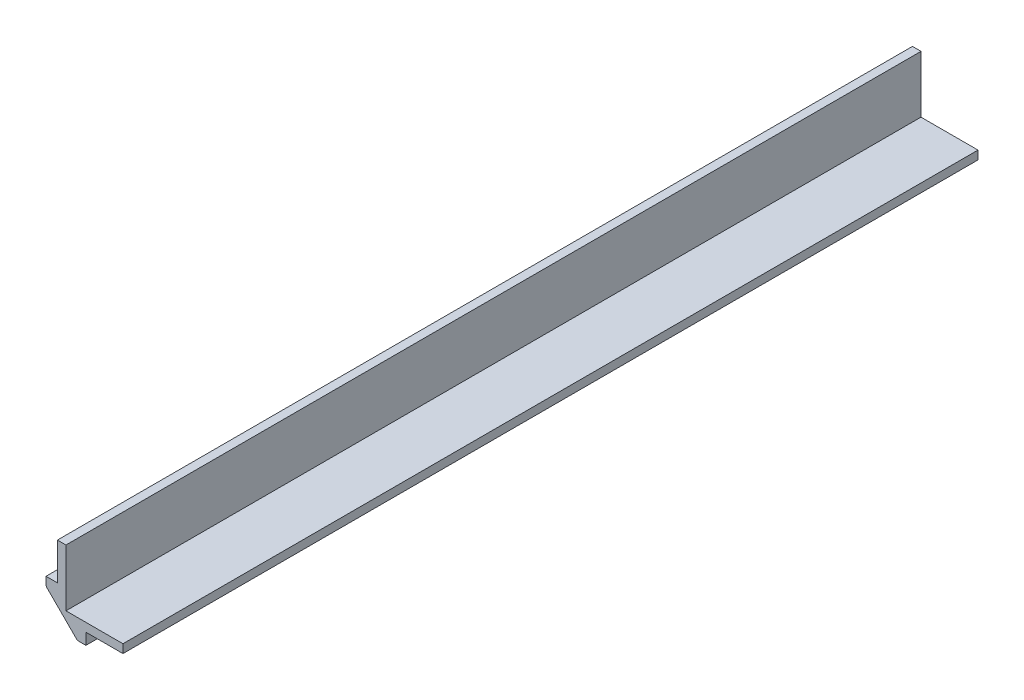
ISO-10303-21;
HEADER;
FILE_DESCRIPTION(('STEP AP214'),'2;1');
FILE_NAME('part.step','',(''),(''),'','','');
FILE_SCHEMA(('AUTOMOTIVE_DESIGN { 1 0 10303 214 1 1 1 1 }'));
ENDSEC;
DATA;
#1=APPLICATION_CONTEXT('core data for automotive mechanical design processes');
#2=APPLICATION_PROTOCOL_DEFINITION('international standard','automotive_design',2000,#1);
#3=PRODUCT_CONTEXT('',#1,'mechanical');
#4=PRODUCT('Part','Part','',(#3));
#5=PRODUCT_RELATED_PRODUCT_CATEGORY('part','',(#4));
#6=PRODUCT_DEFINITION_FORMATION('','',#4);
#7=PRODUCT_DEFINITION_CONTEXT('part definition',#1,'design');
#8=PRODUCT_DEFINITION('design','',#6,#7);
#9=PRODUCT_DEFINITION_SHAPE('','',#8);
#10=(LENGTH_UNIT() NAMED_UNIT(*) SI_UNIT(.MILLI.,.METRE.));
#11=(NAMED_UNIT(*) PLANE_ANGLE_UNIT() SI_UNIT($,.RADIAN.));
#12=(NAMED_UNIT(*) SI_UNIT($,.STERADIAN.) SOLID_ANGLE_UNIT());
#13=UNCERTAINTY_MEASURE_WITH_UNIT(LENGTH_MEASURE(1.E-05),#10,'distance_accuracy_value','');
#14=(GEOMETRIC_REPRESENTATION_CONTEXT(3) GLOBAL_UNCERTAINTY_ASSIGNED_CONTEXT((#13)) GLOBAL_UNIT_ASSIGNED_CONTEXT((#10,
#11,#12)) REPRESENTATION_CONTEXT('',''));
#15=CARTESIAN_POINT('',(0.,0.,0.));
#16=DIRECTION('',(0.,0.,1.));
#17=DIRECTION('',(1.,0.,0.));
#18=AXIS2_PLACEMENT_3D('',#15,#16,#17);
#19=CARTESIAN_POINT('',(-7.,7.,-20.));
#20=DIRECTION('',(-1.,0.,0.));
#21=DIRECTION('',(0.,0.,1.));
#22=AXIS2_PLACEMENT_3D('',#19,#20,#21);
#23=PLANE('',#22);
#24=DIRECTION('',(0.,-1.,0.));
#25=VECTOR('',#24,1.);
#26=CARTESIAN_POINT('',(-7.,7.,-20.));
#27=LINE('',#26,#25);
#28=CARTESIAN_POINT('',(-7.,7.,-20.));
#29=VERTEX_POINT('',#28);
#30=CARTESIAN_POINT('',(-7.,4.62132034355964,-20.));
#31=VERTEX_POINT('',#30);
#32=EDGE_CURVE('E235',#29,#31,#27,.T.);
#33=ORIENTED_EDGE('',*,*,#32,.T.);
#34=DIRECTION('',(0.,0.,1.));
#35=VECTOR('',#34,1.);
#36=CARTESIAN_POINT('',(-7.,4.62132034355964,-20.));
#37=LINE('',#36,#35);
#38=CARTESIAN_POINT('',(-7.,4.62132034355964,280.));
#39=VERTEX_POINT('',#38);
#40=EDGE_CURVE('E239',#31,#39,#37,.T.);
#41=ORIENTED_EDGE('',*,*,#40,.T.);
#42=DIRECTION('',(0.,-1.,0.));
#43=VECTOR('',#42,1.);
#44=CARTESIAN_POINT('',(-7.,7.,280.));
#45=LINE('',#44,#43);
#46=CARTESIAN_POINT('',(-7.,7.,280.));
#47=VERTEX_POINT('',#46);
#48=EDGE_CURVE('E194',#47,#39,#45,.T.);
#49=ORIENTED_EDGE('',*,*,#48,.F.);
#50=DIRECTION('',(0.,0.,1.));
#51=VECTOR('',#50,1.);
#52=CARTESIAN_POINT('',(-7.,7.,-20.));
#53=LINE('',#52,#51);
#54=EDGE_CURVE('E236',#29,#47,#53,.T.);
#55=ORIENTED_EDGE('',*,*,#54,.F.);
#56=EDGE_LOOP('',(#33,#41,#49,#55));
#57=FACE_BOUND('',#56,.T.);
#58=ADVANCED_FACE('F47',(#57),#23,.T.);
#59=CARTESIAN_POINT('',(-3.,7.,-20.));
#60=DIRECTION('',(0.,1.,0.));
#61=DIRECTION('',(0.,0.,1.));
#62=AXIS2_PLACEMENT_3D('',#59,#60,#61);
#63=PLANE('',#62);
#64=DIRECTION('',(-1.,0.,0.));
#65=VECTOR('',#64,1.);
#66=CARTESIAN_POINT('',(-3.,7.,280.));
#67=LINE('',#66,#65);
#68=CARTESIAN_POINT('',(-3.,7.,280.));
#69=VERTEX_POINT('',#68);
#70=EDGE_CURVE('E231',#69,#47,#67,.T.);
#71=ORIENTED_EDGE('',*,*,#70,.F.);
#72=DIRECTION('',(0.,0.,1.));
#73=VECTOR('',#72,1.);
#74=CARTESIAN_POINT('',(-3.,7.,-20.));
#75=LINE('',#74,#73);
#76=CARTESIAN_POINT('',(-3.,7.,-20.));
#77=VERTEX_POINT('',#76);
#78=EDGE_CURVE('E240',#77,#69,#75,.T.);
#79=ORIENTED_EDGE('',*,*,#78,.F.);
#80=DIRECTION('',(-1.,0.,0.));
#81=VECTOR('',#80,1.);
#82=CARTESIAN_POINT('',(-3.,7.,-20.));
#83=LINE('',#82,#81);
#84=EDGE_CURVE('E158',#77,#29,#83,.T.);
#85=ORIENTED_EDGE('',*,*,#84,.T.);
#86=ORIENTED_EDGE('',*,*,#54,.T.);
#87=EDGE_LOOP('',(#71,#79,#85,#86));
#88=FACE_BOUND('',#87,.T.);
#89=ADVANCED_FACE('F321',(#88),#63,.T.);
#90=CARTESIAN_POINT('',(-3.,20.,-20.));
#91=DIRECTION('',(-1.,0.,0.));
#92=DIRECTION('',(0.,0.,1.));
#93=AXIS2_PLACEMENT_3D('',#90,#91,#92);
#94=PLANE('',#93);
#95=DIRECTION('',(0.,-1.,0.));
#96=VECTOR('',#95,1.);
#97=CARTESIAN_POINT('',(-3.,20.,280.));
#98=LINE('',#97,#96);
#99=CARTESIAN_POINT('',(-3.,20.,280.));
#100=VERTEX_POINT('',#99);
#101=EDGE_CURVE('E227',#100,#69,#98,.T.);
#102=ORIENTED_EDGE('',*,*,#101,.F.);
#103=DIRECTION('',(0.,0.,1.));
#104=VECTOR('',#103,1.);
#105=CARTESIAN_POINT('',(-3.,20.,-20.));
#106=LINE('',#105,#104);
#107=CARTESIAN_POINT('',(-3.,20.,-20.));
#108=VERTEX_POINT('',#107);
#109=EDGE_CURVE('E243',#108,#100,#106,.T.);
#110=ORIENTED_EDGE('',*,*,#109,.F.);
#111=DIRECTION('',(0.,-1.,0.));
#112=VECTOR('',#111,1.);
#113=CARTESIAN_POINT('',(-3.,20.,-20.));
#114=LINE('',#113,#112);
#115=EDGE_CURVE('E187',#108,#77,#114,.T.);
#116=ORIENTED_EDGE('',*,*,#115,.T.);
#117=ORIENTED_EDGE('',*,*,#78,.T.);
#118=EDGE_LOOP('',(#102,#110,#116,#117));
#119=FACE_BOUND('',#118,.T.);
#120=ADVANCED_FACE('F318',(#119),#94,.T.);
#121=CARTESIAN_POINT('',(0.,20.,-20.));
#122=DIRECTION('',(0.,1.,0.));
#123=DIRECTION('',(0.,0.,1.));
#124=AXIS2_PLACEMENT_3D('',#121,#122,#123);
#125=PLANE('',#124);
#126=DIRECTION('',(-1.,0.,0.));
#127=VECTOR('',#126,1.);
#128=CARTESIAN_POINT('',(0.,20.,280.));
#129=LINE('',#128,#127);
#130=CARTESIAN_POINT('',(0.,20.,280.));
#131=VERTEX_POINT('',#130);
#132=EDGE_CURVE('E223',#131,#100,#129,.T.);
#133=ORIENTED_EDGE('',*,*,#132,.F.);
#134=DIRECTION('',(0.,0.,1.));
#135=VECTOR('',#134,1.);
#136=CARTESIAN_POINT('',(0.,20.,-20.));
#137=LINE('',#136,#135);
#138=CARTESIAN_POINT('',(0.,20.,-20.));
#139=VERTEX_POINT('',#138);
#140=EDGE_CURVE('E246',#139,#131,#137,.T.);
#141=ORIENTED_EDGE('',*,*,#140,.F.);
#142=DIRECTION('',(-1.,0.,0.));
#143=VECTOR('',#142,1.);
#144=CARTESIAN_POINT('',(0.,20.,-20.));
#145=LINE('',#144,#143);
#146=EDGE_CURVE('E183',#139,#108,#145,.T.);
#147=ORIENTED_EDGE('',*,*,#146,.T.);
#148=ORIENTED_EDGE('',*,*,#109,.T.);
#149=EDGE_LOOP('',(#133,#141,#147,#148));
#150=FACE_BOUND('',#149,.T.);
#151=ADVANCED_FACE('F314',(#150),#125,.T.);
#152=CARTESIAN_POINT('',(0.,0.,-20.));
#153=DIRECTION('',(1.,0.,0.));
#154=DIRECTION('',(0.,1.,0.));
#155=AXIS2_PLACEMENT_3D('',#152,#153,#154);
#156=PLANE('',#155);
#157=DIRECTION('',(0.,1.,0.));
#158=VECTOR('',#157,1.);
#159=CARTESIAN_POINT('',(0.,0.,280.));
#160=LINE('',#159,#158);
#161=CARTESIAN_POINT('',(0.,0.,280.));
#162=VERTEX_POINT('',#161);
#163=EDGE_CURVE('E219',#162,#131,#160,.T.);
#164=ORIENTED_EDGE('',*,*,#163,.F.);
#165=DIRECTION('',(0.,0.,1.));
#166=VECTOR('',#165,1.);
#167=CARTESIAN_POINT('',(0.,0.,-20.));
#168=LINE('',#167,#166);
#169=CARTESIAN_POINT('',(0.,0.,-20.));
#170=VERTEX_POINT('',#169);
#171=EDGE_CURVE('E249',#170,#162,#168,.T.);
#172=ORIENTED_EDGE('',*,*,#171,.F.);
#173=DIRECTION('',(0.,1.,0.));
#174=VECTOR('',#173,1.);
#175=CARTESIAN_POINT('',(0.,0.,-20.));
#176=LINE('',#175,#174);
#177=EDGE_CURVE('E179',#170,#139,#176,.T.);
#178=ORIENTED_EDGE('',*,*,#177,.T.);
#179=ORIENTED_EDGE('',*,*,#140,.T.);
#180=EDGE_LOOP('',(#164,#172,#178,#179));
#181=FACE_BOUND('',#180,.T.);
#182=ADVANCED_FACE('F310',(#181),#156,.T.);
#183=CARTESIAN_POINT('',(20.,0.,-20.));
#184=DIRECTION('',(0.,1.,0.));
#185=DIRECTION('',(0.,0.,1.));
#186=AXIS2_PLACEMENT_3D('',#183,#184,#185);
#187=PLANE('',#186);
#188=DIRECTION('',(-1.,0.,0.));
#189=VECTOR('',#188,1.);
#190=CARTESIAN_POINT('',(20.,0.,280.));
#191=LINE('',#190,#189);
#192=CARTESIAN_POINT('',(20.,0.,280.));
#193=VERTEX_POINT('',#192);
#194=EDGE_CURVE('E215',#193,#162,#191,.T.);
#195=ORIENTED_EDGE('',*,*,#194,.F.);
#196=DIRECTION('',(0.,0.,1.));
#197=VECTOR('',#196,1.);
#198=CARTESIAN_POINT('',(20.,0.,-20.));
#199=LINE('',#198,#197);
#200=CARTESIAN_POINT('',(20.,0.,-20.));
#201=VERTEX_POINT('',#200);
#202=EDGE_CURVE('E252',#201,#193,#199,.T.);
#203=ORIENTED_EDGE('',*,*,#202,.F.);
#204=DIRECTION('',(-1.,0.,0.));
#205=VECTOR('',#204,1.);
#206=CARTESIAN_POINT('',(20.,0.,-20.));
#207=LINE('',#206,#205);
#208=EDGE_CURVE('E175',#201,#170,#207,.T.);
#209=ORIENTED_EDGE('',*,*,#208,.T.);
#210=ORIENTED_EDGE('',*,*,#171,.T.);
#211=EDGE_LOOP('',(#195,#203,#209,#210));
#212=FACE_BOUND('',#211,.T.);
#213=ADVANCED_FACE('F306',(#212),#187,.T.);
#214=CARTESIAN_POINT('',(20.,-3.,-20.));
#215=DIRECTION('',(1.,0.,0.));
#216=DIRECTION('',(0.,0.,-1.));
#217=AXIS2_PLACEMENT_3D('',#214,#215,#216);
#218=PLANE('',#217);
#219=DIRECTION('',(0.,1.,0.));
#220=VECTOR('',#219,1.);
#221=CARTESIAN_POINT('',(20.,-3.,280.));
#222=LINE('',#221,#220);
#223=CARTESIAN_POINT('',(20.,-3.,280.));
#224=VERTEX_POINT('',#223);
#225=EDGE_CURVE('E211',#224,#193,#222,.T.);
#226=ORIENTED_EDGE('',*,*,#225,.F.);
#227=DIRECTION('',(0.,0.,1.));
#228=VECTOR('',#227,1.);
#229=CARTESIAN_POINT('',(20.,-3.,-20.));
#230=LINE('',#229,#228);
#231=CARTESIAN_POINT('',(20.,-3.,-20.));
#232=VERTEX_POINT('',#231);
#233=EDGE_CURVE('E255',#232,#224,#230,.T.);
#234=ORIENTED_EDGE('',*,*,#233,.F.);
#235=DIRECTION('',(0.,1.,0.));
#236=VECTOR('',#235,1.);
#237=CARTESIAN_POINT('',(20.,-3.,-20.));
#238=LINE('',#237,#236);
#239=EDGE_CURVE('E168',#232,#201,#238,.T.);
#240=ORIENTED_EDGE('',*,*,#239,.T.);
#241=ORIENTED_EDGE('',*,*,#202,.T.);
#242=EDGE_LOOP('',(#226,#234,#240,#241));
#243=FACE_BOUND('',#242,.T.);
#244=ADVANCED_FACE('F302',(#243),#218,.T.);
#245=CARTESIAN_POINT('',(7.,-3.,-20.));
#246=DIRECTION('',(0.,-1.,0.));
#247=DIRECTION('',(0.,0.,-1.));
#248=AXIS2_PLACEMENT_3D('',#245,#246,#247);
#249=PLANE('',#248);
#250=DIRECTION('',(1.,0.,0.));
#251=VECTOR('',#250,1.);
#252=CARTESIAN_POINT('',(7.,-3.,280.));
#253=LINE('',#252,#251);
#254=CARTESIAN_POINT('',(7.,-3.,280.));
#255=VERTEX_POINT('',#254);
#256=EDGE_CURVE('E207',#255,#224,#253,.T.);
#257=ORIENTED_EDGE('',*,*,#256,.F.);
#258=DIRECTION('',(0.,0.,1.));
#259=VECTOR('',#258,1.);
#260=CARTESIAN_POINT('',(7.,-3.,-20.));
#261=LINE('',#260,#259);
#262=CARTESIAN_POINT('',(7.,-3.,-20.));
#263=VERTEX_POINT('',#262);
#264=EDGE_CURVE('E157',#263,#255,#261,.T.);
#265=ORIENTED_EDGE('',*,*,#264,.F.);
#266=DIRECTION('',(1.,0.,0.));
#267=VECTOR('',#266,1.);
#268=CARTESIAN_POINT('',(7.,-3.,-20.));
#269=LINE('',#268,#267);
#270=EDGE_CURVE('E164',#263,#232,#269,.T.);
#271=ORIENTED_EDGE('',*,*,#270,.T.);
#272=ORIENTED_EDGE('',*,*,#233,.T.);
#273=EDGE_LOOP('',(#257,#265,#271,#272));
#274=FACE_BOUND('',#273,.T.);
#275=ADVANCED_FACE('F300',(#274),#249,.T.);
#276=CARTESIAN_POINT('',(7.,-7.,-20.));
#277=DIRECTION('',(1.,0.,0.));
#278=DIRECTION('',(0.,0.,-1.));
#279=AXIS2_PLACEMENT_3D('',#276,#277,#278);
#280=PLANE('',#279);
#281=DIRECTION('',(0.,1.,0.));
#282=VECTOR('',#281,1.);
#283=CARTESIAN_POINT('',(7.,-7.,280.));
#284=LINE('',#283,#282);
#285=CARTESIAN_POINT('',(7.,-7.,280.));
#286=VERTEX_POINT('',#285);
#287=EDGE_CURVE('E155',#286,#255,#284,.T.);
#288=ORIENTED_EDGE('',*,*,#287,.F.);
#289=DIRECTION('',(0.,0.,1.));
#290=VECTOR('',#289,1.);
#291=CARTESIAN_POINT('',(7.,-7.,-20.));
#292=LINE('',#291,#290);
#293=CARTESIAN_POINT('',(7.,-7.,-20.));
#294=VERTEX_POINT('',#293);
#295=EDGE_CURVE('E144',#294,#286,#292,.T.);
#296=ORIENTED_EDGE('',*,*,#295,.F.);
#297=DIRECTION('',(0.,1.,0.));
#298=VECTOR('',#297,1.);
#299=CARTESIAN_POINT('',(7.,-7.,-20.));
#300=LINE('',#299,#298);
#301=EDGE_CURVE('E148',#294,#263,#300,.T.);
#302=ORIENTED_EDGE('',*,*,#301,.T.);
#303=ORIENTED_EDGE('',*,*,#264,.T.);
#304=EDGE_LOOP('',(#288,#296,#302,#303));
#305=FACE_BOUND('',#304,.T.);
#306=ADVANCED_FACE('F153',(#305),#280,.T.);
#307=CARTESIAN_POINT('',(4.,-7.,-20.));
#308=DIRECTION('',(0.,-1.,0.));
#309=DIRECTION('',(0.,0.,-1.));
#310=AXIS2_PLACEMENT_3D('',#307,#308,#309);
#311=PLANE('',#310);
#312=DIRECTION('',(1.,0.,0.));
#313=VECTOR('',#312,1.);
#314=CARTESIAN_POINT('',(4.,-7.,280.));
#315=LINE('',#314,#313);
#316=CARTESIAN_POINT('',(4.62132034355964,-7.,280.));
#317=VERTEX_POINT('',#316);
#318=EDGE_CURVE('E202',#317,#286,#315,.T.);
#319=ORIENTED_EDGE('',*,*,#318,.F.);
#320=DIRECTION('',(0.,0.,1.));
#321=VECTOR('',#320,1.);
#322=CARTESIAN_POINT('',(4.62132034355964,-7.,-20.));
#323=LINE('',#322,#321);
#324=CARTESIAN_POINT('',(4.62132034355964,-7.,-20.));
#325=VERTEX_POINT('',#324);
#326=EDGE_CURVE('E11',#317,#325,#323,.F.);
#327=ORIENTED_EDGE('',*,*,#326,.T.);
#328=DIRECTION('',(1.,0.,0.));
#329=VECTOR('',#328,1.);
#330=CARTESIAN_POINT('',(4.,-7.,-20.));
#331=LINE('',#330,#329);
#332=EDGE_CURVE('E141',#325,#294,#331,.T.);
#333=ORIENTED_EDGE('',*,*,#332,.T.);
#334=ORIENTED_EDGE('',*,*,#295,.T.);
#335=EDGE_LOOP('',(#319,#327,#333,#334));
#336=FACE_BOUND('',#335,.T.);
#337=ADVANCED_FACE('F143',(#336),#311,.T.);
#338=CARTESIAN_POINT('',(-7.,4.,-20.));
#339=DIRECTION('',(-0.707106781186548,-0.707106781186548,0.));
#340=DIRECTION('',(0.707106781186548,-0.707106781186548,0.));
#341=AXIS2_PLACEMENT_3D('',#338,#339,#340);
#342=PLANE('',#341);
#343=DIRECTION('',(0.707106781186548,-0.707106781186548,0.));
#344=VECTOR('',#343,1.);
#345=CARTESIAN_POINT('',(-7.,4.,280.));
#346=LINE('',#345,#344);
#347=CARTESIAN_POINT('',(-6.56066017177982,3.56066017177982,280.));
#348=VERTEX_POINT('',#347);
#349=CARTESIAN_POINT('',(3.56066017177982,-6.56066017177982,280.));
#350=VERTEX_POINT('',#349);
#351=EDGE_CURVE('E198',#348,#350,#346,.T.);
#352=ORIENTED_EDGE('',*,*,#351,.F.);
#353=DIRECTION('',(0.,0.,1.));
#354=VECTOR('',#353,1.);
#355=CARTESIAN_POINT('',(-6.56066017177982,3.56066017177982,-20.));
#356=LINE('',#355,#354);
#357=CARTESIAN_POINT('',(-6.56066017177982,3.56066017177982,-20.));
#358=VERTEX_POINT('',#357);
#359=EDGE_CURVE('E273',#348,#358,#356,.F.);
#360=ORIENTED_EDGE('',*,*,#359,.T.);
#361=DIRECTION('',(0.707106781186548,-0.707106781186548,0.));
#362=VECTOR('',#361,1.);
#363=CARTESIAN_POINT('',(-7.,4.,-20.));
#364=LINE('',#363,#362);
#365=CARTESIAN_POINT('',(3.56066017177982,-6.56066017177982,-20.));
#366=VERTEX_POINT('',#365);
#367=EDGE_CURVE('E149',#358,#366,#364,.T.);
#368=ORIENTED_EDGE('',*,*,#367,.T.);
#369=DIRECTION('',(0.,0.,1.));
#370=VECTOR('',#369,1.);
#371=CARTESIAN_POINT('',(3.56066017177982,-6.56066017177982,-20.));
#372=LINE('',#371,#370);
#373=EDGE_CURVE('E269',#366,#350,#372,.T.);
#374=ORIENTED_EDGE('',*,*,#373,.T.);
#375=EDGE_LOOP('',(#352,#360,#368,#374));
#376=FACE_BOUND('',#375,.T.);
#377=ADVANCED_FACE('F294',(#376),#342,.T.);
#378=CARTESIAN_POINT('',(0.,0.,-20.));
#379=DIRECTION('',(0.,0.,1.));
#380=DIRECTION('',(1.,0.,0.));
#381=AXIS2_PLACEMENT_3D('',#378,#379,#380);
#382=PLANE('',#381);
#383=ORIENTED_EDGE('',*,*,#367,.F.);
#384=CARTESIAN_POINT('',(-5.5,4.62132034355964,-20.));
#385=DIRECTION('',(0.,0.,1.));
#386=DIRECTION('',(1.,0.,0.));
#387=AXIS2_PLACEMENT_3D('',#384,#385,#386);
#388=CIRCLE('',#387,1.5);
#389=EDGE_CURVE('E56',#358,#31,#388,.F.);
#390=ORIENTED_EDGE('',*,*,#389,.T.);
#391=ORIENTED_EDGE('',*,*,#32,.F.);
#392=ORIENTED_EDGE('',*,*,#84,.F.);
#393=ORIENTED_EDGE('',*,*,#115,.F.);
#394=ORIENTED_EDGE('',*,*,#146,.F.);
#395=ORIENTED_EDGE('',*,*,#177,.F.);
#396=ORIENTED_EDGE('',*,*,#208,.F.);
#397=ORIENTED_EDGE('',*,*,#239,.F.);
#398=ORIENTED_EDGE('',*,*,#270,.F.);
#399=ORIENTED_EDGE('',*,*,#301,.F.);
#400=ORIENTED_EDGE('',*,*,#332,.F.);
#401=CARTESIAN_POINT('',(4.62132034355964,-5.5,-20.));
#402=DIRECTION('',(0.,0.,1.));
#403=DIRECTION('',(1.,0.,0.));
#404=AXIS2_PLACEMENT_3D('',#401,#402,#403);
#405=CIRCLE('',#404,1.5);
#406=EDGE_CURVE('E68',#325,#366,#405,.F.);
#407=ORIENTED_EDGE('',*,*,#406,.T.);
#408=EDGE_LOOP('',(#383,#390,#391,#392,#393,#394,#395,#396,#397,#398,#399,#400,#407));
#409=FACE_BOUND('',#408,.T.);
#410=ADVANCED_FACE('F161',(#409),#382,.F.);
#411=CARTESIAN_POINT('',(0.,0.,280.));
#412=DIRECTION('',(0.,0.,1.));
#413=DIRECTION('',(1.,0.,0.));
#414=AXIS2_PLACEMENT_3D('',#411,#412,#413);
#415=PLANE('',#414);
#416=ORIENTED_EDGE('',*,*,#48,.T.);
#417=CARTESIAN_POINT('',(-5.5,4.62132034355964,280.));
#418=DIRECTION('',(0.,0.,1.));
#419=DIRECTION('',(1.,0.,0.));
#420=AXIS2_PLACEMENT_3D('',#417,#418,#419);
#421=CIRCLE('',#420,1.5);
#422=EDGE_CURVE('E266',#39,#348,#421,.T.);
#423=ORIENTED_EDGE('',*,*,#422,.T.);
#424=ORIENTED_EDGE('',*,*,#351,.T.);
#425=CARTESIAN_POINT('',(4.62132034355964,-5.5,280.));
#426=DIRECTION('',(0.,0.,1.));
#427=DIRECTION('',(1.,0.,0.));
#428=AXIS2_PLACEMENT_3D('',#425,#426,#427);
#429=CIRCLE('',#428,1.5);
#430=EDGE_CURVE('E263',#350,#317,#429,.T.);
#431=ORIENTED_EDGE('',*,*,#430,.T.);
#432=ORIENTED_EDGE('',*,*,#318,.T.);
#433=ORIENTED_EDGE('',*,*,#287,.T.);
#434=ORIENTED_EDGE('',*,*,#256,.T.);
#435=ORIENTED_EDGE('',*,*,#225,.T.);
#436=ORIENTED_EDGE('',*,*,#194,.T.);
#437=ORIENTED_EDGE('',*,*,#163,.T.);
#438=ORIENTED_EDGE('',*,*,#132,.T.);
#439=ORIENTED_EDGE('',*,*,#101,.T.);
#440=ORIENTED_EDGE('',*,*,#70,.T.);
#441=EDGE_LOOP('',(#416,#423,#424,#431,#432,#433,#434,#435,#436,#437,#438,#439,#440));
#442=FACE_BOUND('',#441,.T.);
#443=ADVANCED_FACE('F292',(#442),#415,.T.);
#444=CARTESIAN_POINT('',(-5.5,4.62132034355964,-20.));
#445=DIRECTION('',(0.,0.,1.));
#446=DIRECTION('',(1.,0.,0.));
#447=AXIS2_PLACEMENT_3D('',#444,#445,#446);
#448=CYLINDRICAL_SURFACE('',#447,1.5);
#449=ORIENTED_EDGE('',*,*,#389,.F.);
#450=ORIENTED_EDGE('',*,*,#359,.F.);
#451=ORIENTED_EDGE('',*,*,#422,.F.);
#452=ORIENTED_EDGE('',*,*,#40,.F.);
#453=EDGE_LOOP('',(#449,#450,#451,#452));
#454=FACE_BOUND('',#453,.T.);
#455=ADVANCED_FACE('F289',(#454),#448,.T.);
#456=CARTESIAN_POINT('',(4.62132034355964,-5.5,-20.));
#457=DIRECTION('',(0.,0.,1.));
#458=DIRECTION('',(1.,0.,0.));
#459=AXIS2_PLACEMENT_3D('',#456,#457,#458);
#460=CYLINDRICAL_SURFACE('',#459,1.5);
#461=ORIENTED_EDGE('',*,*,#406,.F.);
#462=ORIENTED_EDGE('',*,*,#326,.F.);
#463=ORIENTED_EDGE('',*,*,#430,.F.);
#464=ORIENTED_EDGE('',*,*,#373,.F.);
#465=EDGE_LOOP('',(#461,#462,#463,#464));
#466=FACE_BOUND('',#465,.T.);
#467=ADVANCED_FACE('F49',(#466),#460,.T.);
#468=CLOSED_SHELL('',(#58,#89,#120,#151,#182,#213,#244,#275,#306,#337,#377,#410,#443,#455,#467));
#469=MANIFOLD_SOLID_BREP('B2',#468);
#470=ADVANCED_BREP_SHAPE_REPRESENTATION('',(#18,#469),#14);
#471=SHAPE_DEFINITION_REPRESENTATION(#9,#470);
ENDSEC;
END-ISO-10303-21;
